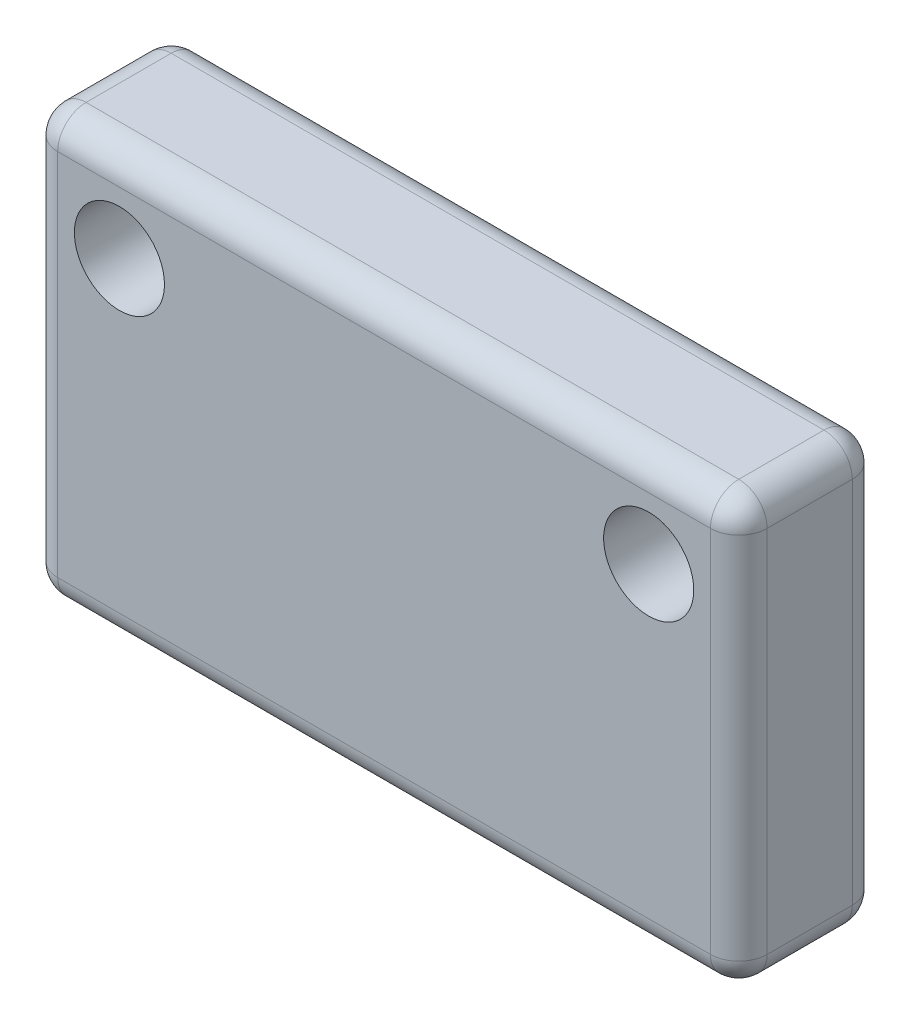
ISO-10303-21;
HEADER;
FILE_DESCRIPTION(('STEP AP214'),'2;1');
FILE_NAME('part.step','',(''),(''),'','','');
FILE_SCHEMA(('AUTOMOTIVE_DESIGN { 1 0 10303 214 1 1 1 1 }'));
ENDSEC;
DATA;
#1=APPLICATION_CONTEXT('core data for automotive mechanical design processes');
#2=APPLICATION_PROTOCOL_DEFINITION('international standard','automotive_design',2000,#1);
#3=PRODUCT_CONTEXT('',#1,'mechanical');
#4=PRODUCT('Part','Part','',(#3));
#5=PRODUCT_RELATED_PRODUCT_CATEGORY('part','',(#4));
#6=PRODUCT_DEFINITION_FORMATION('','',#4);
#7=PRODUCT_DEFINITION_CONTEXT('part definition',#1,'design');
#8=PRODUCT_DEFINITION('design','',#6,#7);
#9=PRODUCT_DEFINITION_SHAPE('','',#8);
#10=(LENGTH_UNIT() NAMED_UNIT(*) SI_UNIT(.MILLI.,.METRE.));
#11=(NAMED_UNIT(*) PLANE_ANGLE_UNIT() SI_UNIT($,.RADIAN.));
#12=(NAMED_UNIT(*) SI_UNIT($,.STERADIAN.) SOLID_ANGLE_UNIT());
#13=UNCERTAINTY_MEASURE_WITH_UNIT(LENGTH_MEASURE(1.E-05),#10,'distance_accuracy_value','');
#14=(GEOMETRIC_REPRESENTATION_CONTEXT(3) GLOBAL_UNCERTAINTY_ASSIGNED_CONTEXT((#13)) GLOBAL_UNIT_ASSIGNED_CONTEXT((#10,
#11,#12)) REPRESENTATION_CONTEXT('',''));
#15=CARTESIAN_POINT('',(0.,0.,0.));
#16=DIRECTION('',(0.,0.,1.));
#17=DIRECTION('',(1.,0.,0.));
#18=AXIS2_PLACEMENT_3D('',#15,#16,#17);
#19=CARTESIAN_POINT('',(-12.5,-7.5,5.));
#20=DIRECTION('',(1.,0.,0.));
#21=DIRECTION('',(0.,0.,-1.));
#22=AXIS2_PLACEMENT_3D('',#19,#20,#21);
#23=PLANE('',#22);
#24=DIRECTION('',(0.,-1.,0.));
#25=VECTOR('',#24,1.);
#26=CARTESIAN_POINT('',(-12.5,7.5,4.));
#27=LINE('',#26,#25);
#28=CARTESIAN_POINT('',(-12.5,-6.5,4.));
#29=VERTEX_POINT('',#28);
#30=CARTESIAN_POINT('',(-12.5,6.5,4.));
#31=VERTEX_POINT('',#30);
#32=EDGE_CURVE('E133',#29,#31,#27,.F.);
#33=ORIENTED_EDGE('',*,*,#32,.T.);
#34=DIRECTION('',(0.,0.,-1.));
#35=VECTOR('',#34,1.);
#36=CARTESIAN_POINT('',(-12.5,6.5,5.));
#37=LINE('',#36,#35);
#38=CARTESIAN_POINT('',(-12.5,6.5,1.));
#39=VERTEX_POINT('',#38);
#40=EDGE_CURVE('E129',#31,#39,#37,.T.);
#41=ORIENTED_EDGE('',*,*,#40,.T.);
#42=DIRECTION('',(0.,-1.,0.));
#43=VECTOR('',#42,1.);
#44=CARTESIAN_POINT('',(-12.5,-7.5,1.));
#45=LINE('',#44,#43);
#46=CARTESIAN_POINT('',(-12.5,-6.5,1.));
#47=VERTEX_POINT('',#46);
#48=EDGE_CURVE('E124',#39,#47,#45,.T.);
#49=ORIENTED_EDGE('',*,*,#48,.T.);
#50=DIRECTION('',(0.,0.,-1.));
#51=VECTOR('',#50,1.);
#52=CARTESIAN_POINT('',(-12.5,-6.5,5.));
#53=LINE('',#52,#51);
#54=EDGE_CURVE('E126',#47,#29,#53,.F.);
#55=ORIENTED_EDGE('',*,*,#54,.T.);
#56=EDGE_LOOP('',(#33,#41,#49,#55));
#57=FACE_BOUND('',#56,.T.);
#58=ADVANCED_FACE('F32',(#57),#23,.F.);
#59=CARTESIAN_POINT('',(12.5,-7.5,5.));
#60=DIRECTION('',(0.,1.,0.));
#61=DIRECTION('',(-1.,0.,0.));
#62=AXIS2_PLACEMENT_3D('',#59,#60,#61);
#63=PLANE('',#62);
#64=DIRECTION('',(1.,0.,0.));
#65=VECTOR('',#64,1.);
#66=CARTESIAN_POINT('',(12.5,-7.5,1.));
#67=LINE('',#66,#65);
#68=CARTESIAN_POINT('',(-11.5,-7.5,1.));
#69=VERTEX_POINT('',#68);
#70=CARTESIAN_POINT('',(11.5,-7.5,1.));
#71=VERTEX_POINT('',#70);
#72=EDGE_CURVE('E237',#69,#71,#67,.T.);
#73=ORIENTED_EDGE('',*,*,#72,.T.);
#74=DIRECTION('',(0.,0.,-1.));
#75=VECTOR('',#74,1.);
#76=CARTESIAN_POINT('',(11.5,-7.5,5.));
#77=LINE('',#76,#75);
#78=CARTESIAN_POINT('',(11.5,-7.5,4.));
#79=VERTEX_POINT('',#78);
#80=EDGE_CURVE('E240',#71,#79,#77,.F.);
#81=ORIENTED_EDGE('',*,*,#80,.T.);
#82=DIRECTION('',(1.,0.,0.));
#83=VECTOR('',#82,1.);
#84=CARTESIAN_POINT('',(-12.5,-7.5,4.));
#85=LINE('',#84,#83);
#86=CARTESIAN_POINT('',(-11.5,-7.5,4.));
#87=VERTEX_POINT('',#86);
#88=EDGE_CURVE('E235',#79,#87,#85,.F.);
#89=ORIENTED_EDGE('',*,*,#88,.T.);
#90=DIRECTION('',(0.,0.,-1.));
#91=VECTOR('',#90,1.);
#92=CARTESIAN_POINT('',(-11.5,-7.5,5.));
#93=LINE('',#92,#91);
#94=EDGE_CURVE('E233',#87,#69,#93,.T.);
#95=ORIENTED_EDGE('',*,*,#94,.T.);
#96=EDGE_LOOP('',(#73,#81,#89,#95));
#97=FACE_BOUND('',#96,.T.);
#98=ADVANCED_FACE('F302',(#97),#63,.F.);
#99=CARTESIAN_POINT('',(12.5,-7.5,5.));
#100=DIRECTION('',(-1.,0.,0.));
#101=DIRECTION('',(0.,0.,1.));
#102=AXIS2_PLACEMENT_3D('',#99,#100,#101);
#103=PLANE('',#102);
#104=DIRECTION('',(0.,1.,0.));
#105=VECTOR('',#104,1.);
#106=CARTESIAN_POINT('',(12.5,-7.5,1.));
#107=LINE('',#106,#105);
#108=CARTESIAN_POINT('',(12.5,-6.5,1.));
#109=VERTEX_POINT('',#108);
#110=CARTESIAN_POINT('',(12.5,6.5,1.));
#111=VERTEX_POINT('',#110);
#112=EDGE_CURVE('E246',#109,#111,#107,.T.);
#113=ORIENTED_EDGE('',*,*,#112,.T.);
#114=DIRECTION('',(0.,0.,-1.));
#115=VECTOR('',#114,1.);
#116=CARTESIAN_POINT('',(12.5,6.5,5.));
#117=LINE('',#116,#115);
#118=CARTESIAN_POINT('',(12.5,6.5,4.));
#119=VERTEX_POINT('',#118);
#120=EDGE_CURVE('E249',#111,#119,#117,.F.);
#121=ORIENTED_EDGE('',*,*,#120,.T.);
#122=DIRECTION('',(0.,1.,0.));
#123=VECTOR('',#122,1.);
#124=CARTESIAN_POINT('',(12.5,-7.5,4.));
#125=LINE('',#124,#123);
#126=CARTESIAN_POINT('',(12.5,-6.5,4.));
#127=VERTEX_POINT('',#126);
#128=EDGE_CURVE('E244',#119,#127,#125,.F.);
#129=ORIENTED_EDGE('',*,*,#128,.T.);
#130=DIRECTION('',(0.,0.,-1.));
#131=VECTOR('',#130,1.);
#132=CARTESIAN_POINT('',(12.5,-6.5,5.));
#133=LINE('',#132,#131);
#134=EDGE_CURVE('E242',#127,#109,#133,.T.);
#135=ORIENTED_EDGE('',*,*,#134,.T.);
#136=EDGE_LOOP('',(#113,#121,#129,#135));
#137=FACE_BOUND('',#136,.T.);
#138=ADVANCED_FACE('F344',(#137),#103,.F.);
#139=CARTESIAN_POINT('',(12.5,7.5,5.));
#140=DIRECTION('',(0.,-1.,0.));
#141=DIRECTION('',(1.,0.,0.));
#142=AXIS2_PLACEMENT_3D('',#139,#140,#141);
#143=PLANE('',#142);
#144=DIRECTION('',(-1.,0.,0.));
#145=VECTOR('',#144,1.);
#146=CARTESIAN_POINT('',(12.5,7.5,1.));
#147=LINE('',#146,#145);
#148=CARTESIAN_POINT('',(11.5,7.5,1.));
#149=VERTEX_POINT('',#148);
#150=CARTESIAN_POINT('',(-11.5,7.5,1.));
#151=VERTEX_POINT('',#150);
#152=EDGE_CURVE('E221',#149,#151,#147,.T.);
#153=ORIENTED_EDGE('',*,*,#152,.T.);
#154=DIRECTION('',(0.,0.,-1.));
#155=VECTOR('',#154,1.);
#156=CARTESIAN_POINT('',(-11.5,7.5,5.));
#157=LINE('',#156,#155);
#158=CARTESIAN_POINT('',(-11.5,7.5,4.));
#159=VERTEX_POINT('',#158);
#160=EDGE_CURVE('E223',#151,#159,#157,.F.);
#161=ORIENTED_EDGE('',*,*,#160,.T.);
#162=DIRECTION('',(-1.,0.,0.));
#163=VECTOR('',#162,1.);
#164=CARTESIAN_POINT('',(12.5,7.5,4.));
#165=LINE('',#164,#163);
#166=CARTESIAN_POINT('',(11.5,7.5,4.));
#167=VERTEX_POINT('',#166);
#168=EDGE_CURVE('E219',#159,#167,#165,.F.);
#169=ORIENTED_EDGE('',*,*,#168,.T.);
#170=DIRECTION('',(0.,0.,-1.));
#171=VECTOR('',#170,1.);
#172=CARTESIAN_POINT('',(11.5,7.5,5.));
#173=LINE('',#172,#171);
#174=EDGE_CURVE('E217',#167,#149,#173,.T.);
#175=ORIENTED_EDGE('',*,*,#174,.T.);
#176=EDGE_LOOP('',(#153,#161,#169,#175));
#177=FACE_BOUND('',#176,.T.);
#178=ADVANCED_FACE('F281',(#177),#143,.F.);
#179=CARTESIAN_POINT('',(0.,0.,5.));
#180=DIRECTION('',(0.,0.,1.));
#181=DIRECTION('',(1.,0.,0.));
#182=AXIS2_PLACEMENT_3D('',#179,#180,#181);
#183=PLANE('',#182);
#184=DIRECTION('',(-1.,0.,0.));
#185=VECTOR('',#184,1.);
#186=CARTESIAN_POINT('',(-12.5,6.5,5.));
#187=LINE('',#186,#185);
#188=CARTESIAN_POINT('',(11.5,6.5,5.));
#189=VERTEX_POINT('',#188);
#190=CARTESIAN_POINT('',(-11.5,6.5,5.));
#191=VERTEX_POINT('',#190);
#192=EDGE_CURVE('E251',#189,#191,#187,.T.);
#193=ORIENTED_EDGE('',*,*,#192,.T.);
#194=DIRECTION('',(0.,-1.,0.));
#195=VECTOR('',#194,1.);
#196=CARTESIAN_POINT('',(-11.5,-7.5,5.));
#197=LINE('',#196,#195);
#198=CARTESIAN_POINT('',(-11.5,-6.5,5.));
#199=VERTEX_POINT('',#198);
#200=EDGE_CURVE('E11',#191,#199,#197,.T.);
#201=ORIENTED_EDGE('',*,*,#200,.T.);
#202=DIRECTION('',(1.,0.,0.));
#203=VECTOR('',#202,1.);
#204=CARTESIAN_POINT('',(12.5,-6.5,5.));
#205=LINE('',#204,#203);
#206=CARTESIAN_POINT('',(11.5,-6.5,5.));
#207=VERTEX_POINT('',#206);
#208=EDGE_CURVE('E41',#199,#207,#205,.T.);
#209=ORIENTED_EDGE('',*,*,#208,.T.);
#210=DIRECTION('',(0.,1.,0.));
#211=VECTOR('',#210,1.);
#212=CARTESIAN_POINT('',(11.5,7.5,5.));
#213=LINE('',#212,#211);
#214=EDGE_CURVE('E253',#207,#189,#213,.T.);
#215=ORIENTED_EDGE('',*,*,#214,.T.);
#216=EDGE_LOOP('',(#193,#201,#209,#215));
#217=FACE_BOUND('',#216,.T.);
#218=CARTESIAN_POINT('',(-9.325,4.325,5.));
#219=DIRECTION('',(0.,0.,1.));
#220=DIRECTION('',(1.,0.,0.));
#221=AXIS2_PLACEMENT_3D('',#218,#219,#220);
#222=CIRCLE('',#221,1.5875);
#223=CARTESIAN_POINT('',(-7.7375,4.325,5.));
#224=VERTEX_POINT('',#223);
#225=EDGE_CURVE('E211',#224,#224,#222,.T.);
#226=ORIENTED_EDGE('',*,*,#225,.F.);
#227=EDGE_LOOP('',(#226));
#228=FACE_BOUND('',#227,.T.);
#229=CARTESIAN_POINT('',(9.325,4.325,5.));
#230=DIRECTION('',(0.,0.,1.));
#231=DIRECTION('',(1.,0.,0.));
#232=AXIS2_PLACEMENT_3D('',#229,#230,#231);
#233=CIRCLE('',#232,1.5875);
#234=CARTESIAN_POINT('',(10.9125,4.325,5.));
#235=VERTEX_POINT('',#234);
#236=EDGE_CURVE('E200',#235,#235,#233,.T.);
#237=ORIENTED_EDGE('',*,*,#236,.F.);
#238=EDGE_LOOP('',(#237));
#239=FACE_BOUND('',#238,.T.);
#240=ADVANCED_FACE('F310',(#217,#228,#239),#183,.T.);
#241=CARTESIAN_POINT('',(0.,0.,0.));
#242=DIRECTION('',(0.,0.,1.));
#243=DIRECTION('',(1.,0.,0.));
#244=AXIS2_PLACEMENT_3D('',#241,#242,#243);
#245=PLANE('',#244);
#246=DIRECTION('',(1.,0.,0.));
#247=VECTOR('',#246,1.);
#248=CARTESIAN_POINT('',(0.,-6.5,0.));
#249=LINE('',#248,#247);
#250=CARTESIAN_POINT('',(11.5,-6.5,0.));
#251=VERTEX_POINT('',#250);
#252=CARTESIAN_POINT('',(-11.5,-6.5,0.));
#253=VERTEX_POINT('',#252);
#254=EDGE_CURVE('E228',#251,#253,#249,.F.);
#255=ORIENTED_EDGE('',*,*,#254,.T.);
#256=DIRECTION('',(0.,-1.,0.));
#257=VECTOR('',#256,1.);
#258=CARTESIAN_POINT('',(-11.5,0.,0.));
#259=LINE('',#258,#257);
#260=CARTESIAN_POINT('',(-11.5,6.5,0.));
#261=VERTEX_POINT('',#260);
#262=EDGE_CURVE('E156',#253,#261,#259,.F.);
#263=ORIENTED_EDGE('',*,*,#262,.T.);
#264=DIRECTION('',(-1.,0.,0.));
#265=VECTOR('',#264,1.);
#266=CARTESIAN_POINT('',(0.,6.5,0.));
#267=LINE('',#266,#265);
#268=CARTESIAN_POINT('',(11.5,6.5,0.));
#269=VERTEX_POINT('',#268);
#270=EDGE_CURVE('E230',#261,#269,#267,.F.);
#271=ORIENTED_EDGE('',*,*,#270,.T.);
#272=DIRECTION('',(0.,1.,0.));
#273=VECTOR('',#272,1.);
#274=CARTESIAN_POINT('',(11.5,0.,0.));
#275=LINE('',#274,#273);
#276=EDGE_CURVE('E226',#269,#251,#275,.F.);
#277=ORIENTED_EDGE('',*,*,#276,.T.);
#278=EDGE_LOOP('',(#255,#263,#271,#277));
#279=FACE_BOUND('',#278,.T.);
#280=CARTESIAN_POINT('',(-9.325,4.325,0.));
#281=DIRECTION('',(0.,0.,1.));
#282=DIRECTION('',(1.,0.,0.));
#283=AXIS2_PLACEMENT_3D('',#280,#281,#282);
#284=CIRCLE('',#283,1.5875);
#285=CARTESIAN_POINT('',(-7.7375,4.325,0.));
#286=VERTEX_POINT('',#285);
#287=EDGE_CURVE('E144',#286,#286,#284,.T.);
#288=ORIENTED_EDGE('',*,*,#287,.T.);
#289=EDGE_LOOP('',(#288));
#290=FACE_BOUND('',#289,.T.);
#291=CARTESIAN_POINT('',(9.325,4.325,0.));
#292=DIRECTION('',(0.,0.,1.));
#293=DIRECTION('',(1.,0.,0.));
#294=AXIS2_PLACEMENT_3D('',#291,#292,#293);
#295=CIRCLE('',#294,1.5875);
#296=CARTESIAN_POINT('',(10.9125,4.325,0.));
#297=VERTEX_POINT('',#296);
#298=EDGE_CURVE('E206',#297,#297,#295,.T.);
#299=ORIENTED_EDGE('',*,*,#298,.T.);
#300=EDGE_LOOP('',(#299));
#301=FACE_BOUND('',#300,.T.);
#302=ADVANCED_FACE('F295',(#279,#290,#301),#245,.F.);
#303=CARTESIAN_POINT('',(9.325,4.325,0.));
#304=DIRECTION('',(0.,0.,1.));
#305=DIRECTION('',(1.,0.,0.));
#306=AXIS2_PLACEMENT_3D('',#303,#304,#305);
#307=CYLINDRICAL_SURFACE('',#306,1.5875);
#308=ORIENTED_EDGE('',*,*,#298,.F.);
#309=EDGE_LOOP('',(#308));
#310=FACE_BOUND('',#309,.T.);
#311=ORIENTED_EDGE('',*,*,#236,.T.);
#312=EDGE_LOOP('',(#311));
#313=FACE_BOUND('',#312,.T.);
#314=ADVANCED_FACE('F505',(#310,#313),#307,.F.);
#315=CARTESIAN_POINT('',(-9.325,4.325,0.));
#316=DIRECTION('',(0.,0.,1.));
#317=DIRECTION('',(1.,0.,0.));
#318=AXIS2_PLACEMENT_3D('',#315,#316,#317);
#319=CYLINDRICAL_SURFACE('',#318,1.5875);
#320=ORIENTED_EDGE('',*,*,#287,.F.);
#321=EDGE_LOOP('',(#320));
#322=FACE_BOUND('',#321,.T.);
#323=ORIENTED_EDGE('',*,*,#225,.T.);
#324=EDGE_LOOP('',(#323));
#325=FACE_BOUND('',#324,.T.);
#326=ADVANCED_FACE('F496',(#322,#325),#319,.F.);
#327=CARTESIAN_POINT('',(11.5,-6.5,5.));
#328=DIRECTION('',(0.,0.,-1.));
#329=DIRECTION('',(-1.,0.,0.));
#330=AXIS2_PLACEMENT_3D('',#327,#328,#329);
#331=CYLINDRICAL_SURFACE('',#330,1.);
#332=CARTESIAN_POINT('',(11.5,-6.5,4.));
#333=DIRECTION('',(0.,0.,1.));
#334=DIRECTION('',(1.,0.,0.));
#335=AXIS2_PLACEMENT_3D('',#332,#333,#334);
#336=CIRCLE('',#335,1.);
#337=EDGE_CURVE('E36',#79,#127,#336,.T.);
#338=ORIENTED_EDGE('',*,*,#337,.F.);
#339=ORIENTED_EDGE('',*,*,#80,.F.);
#340=CARTESIAN_POINT('',(11.5,-6.5,1.));
#341=DIRECTION('',(0.,0.,-1.));
#342=DIRECTION('',(-1.,0.,0.));
#343=AXIS2_PLACEMENT_3D('',#340,#341,#342);
#344=CIRCLE('',#343,1.);
#345=EDGE_CURVE('E192',#109,#71,#344,.T.);
#346=ORIENTED_EDGE('',*,*,#345,.F.);
#347=ORIENTED_EDGE('',*,*,#134,.F.);
#348=EDGE_LOOP('',(#338,#339,#346,#347));
#349=FACE_BOUND('',#348,.T.);
#350=ADVANCED_FACE('F34',(#349),#331,.T.);
#351=CARTESIAN_POINT('',(11.5,-6.5,4.));
#352=DIRECTION('',(0.,0.,1.));
#353=DIRECTION('',(1.,0.,0.));
#354=AXIS2_PLACEMENT_3D('',#351,#352,#353);
#355=SPHERICAL_SURFACE('',#354,1.);
#356=CARTESIAN_POINT('',(11.5,-6.5,4.));
#357=DIRECTION('',(1.,0.,0.));
#358=DIRECTION('',(0.,0.,-1.));
#359=AXIS2_PLACEMENT_3D('',#356,#357,#358);
#360=CIRCLE('',#359,1.);
#361=EDGE_CURVE('E188',#79,#207,#360,.F.);
#362=ORIENTED_EDGE('',*,*,#361,.F.);
#363=ORIENTED_EDGE('',*,*,#337,.T.);
#364=CARTESIAN_POINT('',(11.5,-6.5,4.));
#365=DIRECTION('',(0.,-1.,0.));
#366=DIRECTION('',(0.,0.,-1.));
#367=AXIS2_PLACEMENT_3D('',#364,#365,#366);
#368=CIRCLE('',#367,1.);
#369=EDGE_CURVE('E190',#207,#127,#368,.F.);
#370=ORIENTED_EDGE('',*,*,#369,.F.);
#371=EDGE_LOOP('',(#362,#363,#370));
#372=FACE_BOUND('',#371,.T.);
#373=ADVANCED_FACE('F332',(#372),#355,.T.);
#374=CARTESIAN_POINT('',(11.5,-6.5,1.));
#375=DIRECTION('',(0.,0.,1.));
#376=DIRECTION('',(1.,0.,0.));
#377=AXIS2_PLACEMENT_3D('',#374,#375,#376);
#378=SPHERICAL_SURFACE('',#377,1.);
#379=CARTESIAN_POINT('',(11.5,-6.5,1.));
#380=DIRECTION('',(0.,-1.,0.));
#381=DIRECTION('',(0.,0.,-1.));
#382=AXIS2_PLACEMENT_3D('',#379,#380,#381);
#383=CIRCLE('',#382,1.);
#384=EDGE_CURVE('E183',#109,#251,#383,.F.);
#385=ORIENTED_EDGE('',*,*,#384,.F.);
#386=ORIENTED_EDGE('',*,*,#345,.T.);
#387=CARTESIAN_POINT('',(11.5,-6.5,1.));
#388=DIRECTION('',(1.,0.,0.));
#389=DIRECTION('',(0.,0.,-1.));
#390=AXIS2_PLACEMENT_3D('',#387,#388,#389);
#391=CIRCLE('',#390,1.);
#392=EDGE_CURVE('E186',#251,#71,#391,.F.);
#393=ORIENTED_EDGE('',*,*,#392,.F.);
#394=EDGE_LOOP('',(#385,#386,#393));
#395=FACE_BOUND('',#394,.T.);
#396=ADVANCED_FACE('F330',(#395),#378,.T.);
#397=CARTESIAN_POINT('',(11.5,0.,4.));
#398=DIRECTION('',(0.,-1.,0.));
#399=DIRECTION('',(0.,0.,-1.));
#400=AXIS2_PLACEMENT_3D('',#397,#398,#399);
#401=CYLINDRICAL_SURFACE('',#400,1.);
#402=ORIENTED_EDGE('',*,*,#369,.T.);
#403=ORIENTED_EDGE('',*,*,#128,.F.);
#404=CARTESIAN_POINT('',(11.5,6.5,4.));
#405=DIRECTION('',(0.,1.,0.));
#406=DIRECTION('',(0.,0.,1.));
#407=AXIS2_PLACEMENT_3D('',#404,#405,#406);
#408=CIRCLE('',#407,1.);
#409=EDGE_CURVE('E177',#189,#119,#408,.T.);
#410=ORIENTED_EDGE('',*,*,#409,.F.);
#411=ORIENTED_EDGE('',*,*,#214,.F.);
#412=EDGE_LOOP('',(#402,#403,#410,#411));
#413=FACE_BOUND('',#412,.T.);
#414=ADVANCED_FACE('F316',(#413),#401,.T.);
#415=CARTESIAN_POINT('',(0.,-6.5,4.));
#416=DIRECTION('',(-1.,0.,0.));
#417=DIRECTION('',(0.,-1.,0.));
#418=AXIS2_PLACEMENT_3D('',#415,#416,#417);
#419=CYLINDRICAL_SURFACE('',#418,1.);
#420=ORIENTED_EDGE('',*,*,#361,.T.);
#421=ORIENTED_EDGE('',*,*,#208,.F.);
#422=CARTESIAN_POINT('',(-11.5,-6.5,4.));
#423=DIRECTION('',(-1.,0.,0.));
#424=DIRECTION('',(0.,0.,1.));
#425=AXIS2_PLACEMENT_3D('',#422,#423,#424);
#426=CIRCLE('',#425,1.);
#427=EDGE_CURVE('E175',#87,#199,#426,.T.);
#428=ORIENTED_EDGE('',*,*,#427,.F.);
#429=ORIENTED_EDGE('',*,*,#88,.F.);
#430=EDGE_LOOP('',(#420,#421,#428,#429));
#431=FACE_BOUND('',#430,.T.);
#432=ADVANCED_FACE('F306',(#431),#419,.T.);
#433=CARTESIAN_POINT('',(-11.5,-6.5,5.));
#434=DIRECTION('',(0.,0.,-1.));
#435=DIRECTION('',(-1.,0.,0.));
#436=AXIS2_PLACEMENT_3D('',#433,#434,#435);
#437=CYLINDRICAL_SURFACE('',#436,1.);
#438=CARTESIAN_POINT('',(-11.5,-6.5,1.));
#439=DIRECTION('',(0.,0.,-1.));
#440=DIRECTION('',(-1.,0.,0.));
#441=AXIS2_PLACEMENT_3D('',#438,#439,#440);
#442=CIRCLE('',#441,1.);
#443=EDGE_CURVE('E140',#69,#47,#442,.T.);
#444=ORIENTED_EDGE('',*,*,#443,.F.);
#445=ORIENTED_EDGE('',*,*,#94,.F.);
#446=CARTESIAN_POINT('',(-11.5,-6.5,4.));
#447=DIRECTION('',(0.,0.,1.));
#448=DIRECTION('',(1.,0.,0.));
#449=AXIS2_PLACEMENT_3D('',#446,#447,#448);
#450=CIRCLE('',#449,1.);
#451=EDGE_CURVE('E143',#29,#87,#450,.T.);
#452=ORIENTED_EDGE('',*,*,#451,.F.);
#453=ORIENTED_EDGE('',*,*,#54,.F.);
#454=EDGE_LOOP('',(#444,#445,#452,#453));
#455=FACE_BOUND('',#454,.T.);
#456=ADVANCED_FACE('F138',(#455),#437,.T.);
#457=CARTESIAN_POINT('',(12.5,-6.5,1.));
#458=DIRECTION('',(1.,0.,0.));
#459=DIRECTION('',(0.,1.,0.));
#460=AXIS2_PLACEMENT_3D('',#457,#458,#459);
#461=CYLINDRICAL_SURFACE('',#460,1.);
#462=ORIENTED_EDGE('',*,*,#392,.T.);
#463=ORIENTED_EDGE('',*,*,#72,.F.);
#464=CARTESIAN_POINT('',(-11.5,-6.5,1.));
#465=DIRECTION('',(-1.,0.,0.));
#466=DIRECTION('',(0.,-1.,0.));
#467=AXIS2_PLACEMENT_3D('',#464,#465,#466);
#468=CIRCLE('',#467,1.);
#469=EDGE_CURVE('E152',#253,#69,#468,.T.);
#470=ORIENTED_EDGE('',*,*,#469,.F.);
#471=ORIENTED_EDGE('',*,*,#254,.F.);
#472=EDGE_LOOP('',(#462,#463,#470,#471));
#473=FACE_BOUND('',#472,.T.);
#474=ADVANCED_FACE('F300',(#473),#461,.T.);
#475=CARTESIAN_POINT('',(11.5,-7.5,1.));
#476=DIRECTION('',(0.,1.,0.));
#477=DIRECTION('',(0.,0.,1.));
#478=AXIS2_PLACEMENT_3D('',#475,#476,#477);
#479=CYLINDRICAL_SURFACE('',#478,1.);
#480=ORIENTED_EDGE('',*,*,#384,.T.);
#481=ORIENTED_EDGE('',*,*,#276,.F.);
#482=CARTESIAN_POINT('',(11.5,6.5,1.));
#483=DIRECTION('',(0.,1.,0.));
#484=DIRECTION('',(0.,0.,1.));
#485=AXIS2_PLACEMENT_3D('',#482,#483,#484);
#486=CIRCLE('',#485,1.);
#487=EDGE_CURVE('E170',#111,#269,#486,.T.);
#488=ORIENTED_EDGE('',*,*,#487,.F.);
#489=ORIENTED_EDGE('',*,*,#112,.F.);
#490=EDGE_LOOP('',(#480,#481,#488,#489));
#491=FACE_BOUND('',#490,.T.);
#492=ADVANCED_FACE('F329',(#491),#479,.T.);
#493=CARTESIAN_POINT('',(11.5,6.5,5.));
#494=DIRECTION('',(0.,0.,-1.));
#495=DIRECTION('',(-1.,0.,0.));
#496=AXIS2_PLACEMENT_3D('',#493,#494,#495);
#497=CYLINDRICAL_SURFACE('',#496,1.);
#498=CARTESIAN_POINT('',(11.5,6.5,4.));
#499=DIRECTION('',(0.,0.,1.));
#500=DIRECTION('',(1.,0.,0.));
#501=AXIS2_PLACEMENT_3D('',#498,#499,#500);
#502=CIRCLE('',#501,1.);
#503=EDGE_CURVE('E180',#119,#167,#502,.T.);
#504=ORIENTED_EDGE('',*,*,#503,.F.);
#505=ORIENTED_EDGE('',*,*,#120,.F.);
#506=CARTESIAN_POINT('',(11.5,6.5,1.));
#507=DIRECTION('',(0.,0.,-1.));
#508=DIRECTION('',(-1.,0.,0.));
#509=AXIS2_PLACEMENT_3D('',#506,#507,#508);
#510=CIRCLE('',#509,1.);
#511=EDGE_CURVE('E168',#149,#111,#510,.T.);
#512=ORIENTED_EDGE('',*,*,#511,.F.);
#513=ORIENTED_EDGE('',*,*,#174,.F.);
#514=EDGE_LOOP('',(#504,#505,#512,#513));
#515=FACE_BOUND('',#514,.T.);
#516=ADVANCED_FACE('F322',(#515),#497,.T.);
#517=CARTESIAN_POINT('',(11.5,6.5,4.));
#518=DIRECTION('',(0.,0.,1.));
#519=DIRECTION('',(1.,0.,0.));
#520=AXIS2_PLACEMENT_3D('',#517,#518,#519);
#521=SPHERICAL_SURFACE('',#520,1.);
#522=ORIENTED_EDGE('',*,*,#409,.T.);
#523=ORIENTED_EDGE('',*,*,#503,.T.);
#524=CARTESIAN_POINT('',(11.5,6.5,4.));
#525=DIRECTION('',(1.,0.,0.));
#526=DIRECTION('',(0.,0.,-1.));
#527=AXIS2_PLACEMENT_3D('',#524,#525,#526);
#528=CIRCLE('',#527,1.);
#529=EDGE_CURVE('E159',#189,#167,#528,.F.);
#530=ORIENTED_EDGE('',*,*,#529,.F.);
#531=EDGE_LOOP('',(#522,#523,#530));
#532=FACE_BOUND('',#531,.T.);
#533=ADVANCED_FACE('F319',(#532),#521,.T.);
#534=CARTESIAN_POINT('',(-11.5,-6.5,4.));
#535=DIRECTION('',(0.,0.,1.));
#536=DIRECTION('',(1.,0.,0.));
#537=AXIS2_PLACEMENT_3D('',#534,#535,#536);
#538=SPHERICAL_SURFACE('',#537,1.);
#539=ORIENTED_EDGE('',*,*,#451,.T.);
#540=ORIENTED_EDGE('',*,*,#427,.T.);
#541=CARTESIAN_POINT('',(-11.5,-6.5,4.));
#542=DIRECTION('',(0.,-1.,0.));
#543=DIRECTION('',(0.,0.,-1.));
#544=AXIS2_PLACEMENT_3D('',#541,#542,#543);
#545=CIRCLE('',#544,1.);
#546=EDGE_CURVE('E49',#29,#199,#545,.F.);
#547=ORIENTED_EDGE('',*,*,#546,.F.);
#548=EDGE_LOOP('',(#539,#540,#547));
#549=FACE_BOUND('',#548,.T.);
#550=ADVANCED_FACE('F308',(#549),#538,.T.);
#551=CARTESIAN_POINT('',(-11.5,-6.5,1.));
#552=DIRECTION('',(0.,0.,1.));
#553=DIRECTION('',(1.,0.,0.));
#554=AXIS2_PLACEMENT_3D('',#551,#552,#553);
#555=SPHERICAL_SURFACE('',#554,1.);
#556=ORIENTED_EDGE('',*,*,#469,.T.);
#557=ORIENTED_EDGE('',*,*,#443,.T.);
#558=CARTESIAN_POINT('',(-11.5,-6.5,1.));
#559=DIRECTION('',(0.,-1.,0.));
#560=DIRECTION('',(0.,0.,-1.));
#561=AXIS2_PLACEMENT_3D('',#558,#559,#560);
#562=CIRCLE('',#561,1.);
#563=EDGE_CURVE('E149',#253,#47,#562,.F.);
#564=ORIENTED_EDGE('',*,*,#563,.F.);
#565=EDGE_LOOP('',(#556,#557,#564));
#566=FACE_BOUND('',#565,.T.);
#567=ADVANCED_FACE('F148',(#566),#555,.T.);
#568=CARTESIAN_POINT('',(11.5,6.5,1.));
#569=DIRECTION('',(0.,0.,1.));
#570=DIRECTION('',(1.,0.,0.));
#571=AXIS2_PLACEMENT_3D('',#568,#569,#570);
#572=SPHERICAL_SURFACE('',#571,1.);
#573=ORIENTED_EDGE('',*,*,#511,.T.);
#574=ORIENTED_EDGE('',*,*,#487,.T.);
#575=CARTESIAN_POINT('',(11.5,6.5,1.));
#576=DIRECTION('',(1.,0.,0.));
#577=DIRECTION('',(0.,0.,-1.));
#578=AXIS2_PLACEMENT_3D('',#575,#576,#577);
#579=CIRCLE('',#578,1.);
#580=EDGE_CURVE('E157',#149,#269,#579,.F.);
#581=ORIENTED_EDGE('',*,*,#580,.F.);
#582=EDGE_LOOP('',(#573,#574,#581));
#583=FACE_BOUND('',#582,.T.);
#584=ADVANCED_FACE('F326',(#583),#572,.T.);
#585=CARTESIAN_POINT('',(0.,6.5,4.));
#586=DIRECTION('',(1.,0.,0.));
#587=DIRECTION('',(0.,1.,0.));
#588=AXIS2_PLACEMENT_3D('',#585,#586,#587);
#589=CYLINDRICAL_SURFACE('',#588,1.);
#590=ORIENTED_EDGE('',*,*,#529,.T.);
#591=ORIENTED_EDGE('',*,*,#168,.F.);
#592=CARTESIAN_POINT('',(-11.5,6.5,4.));
#593=DIRECTION('',(-1.,0.,0.));
#594=DIRECTION('',(0.,0.,1.));
#595=AXIS2_PLACEMENT_3D('',#592,#593,#594);
#596=CIRCLE('',#595,1.);
#597=EDGE_CURVE('E162',#191,#159,#596,.T.);
#598=ORIENTED_EDGE('',*,*,#597,.F.);
#599=ORIENTED_EDGE('',*,*,#192,.F.);
#600=EDGE_LOOP('',(#590,#591,#598,#599));
#601=FACE_BOUND('',#600,.T.);
#602=ADVANCED_FACE('F276',(#601),#589,.T.);
#603=CARTESIAN_POINT('',(-11.5,0.,4.));
#604=DIRECTION('',(0.,1.,0.));
#605=DIRECTION('',(0.,0.,1.));
#606=AXIS2_PLACEMENT_3D('',#603,#604,#605);
#607=CYLINDRICAL_SURFACE('',#606,1.);
#608=ORIENTED_EDGE('',*,*,#546,.T.);
#609=ORIENTED_EDGE('',*,*,#200,.F.);
#610=CARTESIAN_POINT('',(-11.5,6.5,4.));
#611=DIRECTION('',(0.,1.,0.));
#612=DIRECTION('',(0.,0.,1.));
#613=AXIS2_PLACEMENT_3D('',#610,#611,#612);
#614=CIRCLE('',#613,1.);
#615=EDGE_CURVE('E265',#31,#191,#614,.T.);
#616=ORIENTED_EDGE('',*,*,#615,.F.);
#617=ORIENTED_EDGE('',*,*,#32,.F.);
#618=EDGE_LOOP('',(#608,#609,#616,#617));
#619=FACE_BOUND('',#618,.T.);
#620=ADVANCED_FACE('F309',(#619),#607,.T.);
#621=CARTESIAN_POINT('',(-11.5,-7.5,1.));
#622=DIRECTION('',(0.,-1.,0.));
#623=DIRECTION('',(0.,0.,-1.));
#624=AXIS2_PLACEMENT_3D('',#621,#622,#623);
#625=CYLINDRICAL_SURFACE('',#624,1.);
#626=ORIENTED_EDGE('',*,*,#563,.T.);
#627=ORIENTED_EDGE('',*,*,#48,.F.);
#628=CARTESIAN_POINT('',(-11.5,6.5,1.));
#629=DIRECTION('',(0.,1.,0.));
#630=DIRECTION('',(0.,0.,1.));
#631=AXIS2_PLACEMENT_3D('',#628,#629,#630);
#632=CIRCLE('',#631,1.);
#633=EDGE_CURVE('E262',#261,#39,#632,.T.);
#634=ORIENTED_EDGE('',*,*,#633,.F.);
#635=ORIENTED_EDGE('',*,*,#262,.F.);
#636=EDGE_LOOP('',(#626,#627,#634,#635));
#637=FACE_BOUND('',#636,.T.);
#638=ADVANCED_FACE('F154',(#637),#625,.T.);
#639=CARTESIAN_POINT('',(12.5,6.5,1.));
#640=DIRECTION('',(-1.,0.,0.));
#641=DIRECTION('',(0.,-1.,0.));
#642=AXIS2_PLACEMENT_3D('',#639,#640,#641);
#643=CYLINDRICAL_SURFACE('',#642,1.);
#644=ORIENTED_EDGE('',*,*,#580,.T.);
#645=ORIENTED_EDGE('',*,*,#270,.F.);
#646=CARTESIAN_POINT('',(-11.5,6.5,1.));
#647=DIRECTION('',(-1.,0.,0.));
#648=DIRECTION('',(0.,0.,1.));
#649=AXIS2_PLACEMENT_3D('',#646,#647,#648);
#650=CIRCLE('',#649,1.);
#651=EDGE_CURVE('E260',#151,#261,#650,.T.);
#652=ORIENTED_EDGE('',*,*,#651,.F.);
#653=ORIENTED_EDGE('',*,*,#152,.F.);
#654=EDGE_LOOP('',(#644,#645,#652,#653));
#655=FACE_BOUND('',#654,.T.);
#656=ADVANCED_FACE('F291',(#655),#643,.T.);
#657=CARTESIAN_POINT('',(-11.5,6.5,4.));
#658=DIRECTION('',(0.,0.,1.));
#659=DIRECTION('',(1.,0.,0.));
#660=AXIS2_PLACEMENT_3D('',#657,#658,#659);
#661=SPHERICAL_SURFACE('',#660,1.);
#662=ORIENTED_EDGE('',*,*,#615,.T.);
#663=ORIENTED_EDGE('',*,*,#597,.T.);
#664=CARTESIAN_POINT('',(-11.5,6.5,4.));
#665=DIRECTION('',(0.,0.,1.));
#666=DIRECTION('',(1.,0.,0.));
#667=AXIS2_PLACEMENT_3D('',#664,#665,#666);
#668=CIRCLE('',#667,1.);
#669=EDGE_CURVE('E258',#31,#159,#668,.F.);
#670=ORIENTED_EDGE('',*,*,#669,.F.);
#671=EDGE_LOOP('',(#662,#663,#670));
#672=FACE_BOUND('',#671,.T.);
#673=ADVANCED_FACE('F272',(#672),#661,.T.);
#674=CARTESIAN_POINT('',(-11.5,6.5,1.));
#675=DIRECTION('',(0.,0.,1.));
#676=DIRECTION('',(1.,0.,0.));
#677=AXIS2_PLACEMENT_3D('',#674,#675,#676);
#678=SPHERICAL_SURFACE('',#677,1.);
#679=ORIENTED_EDGE('',*,*,#651,.T.);
#680=ORIENTED_EDGE('',*,*,#633,.T.);
#681=CARTESIAN_POINT('',(-11.5,6.5,1.));
#682=DIRECTION('',(0.,0.,-1.));
#683=DIRECTION('',(-1.,0.,0.));
#684=AXIS2_PLACEMENT_3D('',#681,#682,#683);
#685=CIRCLE('',#684,1.);
#686=EDGE_CURVE('E256',#151,#39,#685,.F.);
#687=ORIENTED_EDGE('',*,*,#686,.F.);
#688=EDGE_LOOP('',(#679,#680,#687));
#689=FACE_BOUND('',#688,.T.);
#690=ADVANCED_FACE('F288',(#689),#678,.T.);
#691=CARTESIAN_POINT('',(-11.5,6.5,5.));
#692=DIRECTION('',(0.,0.,-1.));
#693=DIRECTION('',(-1.,0.,0.));
#694=AXIS2_PLACEMENT_3D('',#691,#692,#693);
#695=CYLINDRICAL_SURFACE('',#694,1.);
#696=ORIENTED_EDGE('',*,*,#669,.T.);
#697=ORIENTED_EDGE('',*,*,#160,.F.);
#698=ORIENTED_EDGE('',*,*,#686,.T.);
#699=ORIENTED_EDGE('',*,*,#40,.F.);
#700=EDGE_LOOP('',(#696,#697,#698,#699));
#701=FACE_BOUND('',#700,.T.);
#702=ADVANCED_FACE('F286',(#701),#695,.T.);
#703=CLOSED_SHELL('',(#58,#98,#138,#178,#240,#302,#314,#326,#350,#373,#396,#414,#432,#456,#474,
#492,#516,#533,#550,#567,#584,#602,#620,#638,#656,#673,#690,#702));
#704=MANIFOLD_SOLID_BREP('B2',#703);
#705=ADVANCED_BREP_SHAPE_REPRESENTATION('',(#18,#704),#14);
#706=SHAPE_DEFINITION_REPRESENTATION(#9,#705);
ENDSEC;
END-ISO-10303-21;
